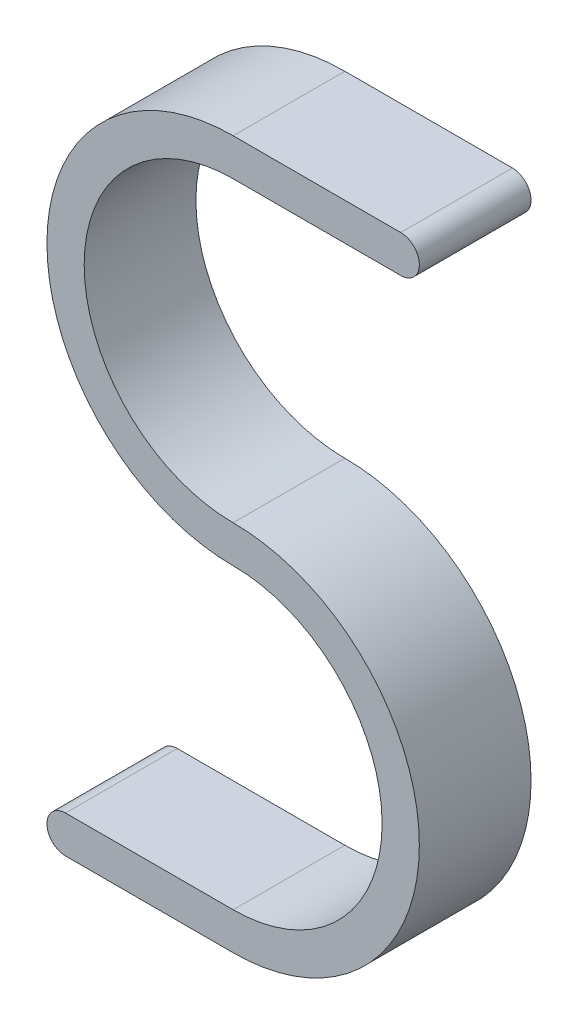
ISO-10303-21;
HEADER;
FILE_DESCRIPTION(('STEP AP214'),'2;1');
FILE_NAME('part.step','',(''),(''),'','','');
FILE_SCHEMA(('AUTOMOTIVE_DESIGN { 1 0 10303 214 1 1 1 1 }'));
ENDSEC;
DATA;
#1=APPLICATION_CONTEXT('core data for automotive mechanical design processes');
#2=APPLICATION_PROTOCOL_DEFINITION('international standard','automotive_design',2000,#1);
#3=PRODUCT_CONTEXT('',#1,'mechanical');
#4=PRODUCT('Part','Part','',(#3));
#5=PRODUCT_RELATED_PRODUCT_CATEGORY('part','',(#4));
#6=PRODUCT_DEFINITION_FORMATION('','',#4);
#7=PRODUCT_DEFINITION_CONTEXT('part definition',#1,'design');
#8=PRODUCT_DEFINITION('design','',#6,#7);
#9=PRODUCT_DEFINITION_SHAPE('','',#8);
#10=(LENGTH_UNIT() NAMED_UNIT(*) SI_UNIT(.MILLI.,.METRE.));
#11=(NAMED_UNIT(*) PLANE_ANGLE_UNIT() SI_UNIT($,.RADIAN.));
#12=(NAMED_UNIT(*) SI_UNIT($,.STERADIAN.) SOLID_ANGLE_UNIT());
#13=UNCERTAINTY_MEASURE_WITH_UNIT(LENGTH_MEASURE(1.E-05),#10,'distance_accuracy_value','');
#14=(GEOMETRIC_REPRESENTATION_CONTEXT(3) GLOBAL_UNCERTAINTY_ASSIGNED_CONTEXT((#13)) GLOBAL_UNIT_ASSIGNED_CONTEXT((#10,
#11,#12)) REPRESENTATION_CONTEXT('',''));
#15=CARTESIAN_POINT('',(0.,0.,0.));
#16=DIRECTION('',(0.,0.,1.));
#17=DIRECTION('',(1.,0.,0.));
#18=AXIS2_PLACEMENT_3D('',#15,#16,#17);
#19=CARTESIAN_POINT('',(0.,0.,15.));
#20=DIRECTION('',(0.,0.,-1.));
#21=DIRECTION('',(-1.,0.,0.));
#22=AXIS2_PLACEMENT_3D('',#19,#20,#21);
#23=CYLINDRICAL_SURFACE('',#22,2.5);
#24=CARTESIAN_POINT('',(0.,0.,0.));
#25=DIRECTION('',(0.,0.,1.));
#26=DIRECTION('',(1.,0.,0.));
#27=AXIS2_PLACEMENT_3D('',#24,#25,#26);
#28=CIRCLE('',#27,2.5);
#29=CARTESIAN_POINT('',(0.,-2.5,0.));
#30=VERTEX_POINT('',#29);
#31=CARTESIAN_POINT('',(0.,2.5,0.));
#32=VERTEX_POINT('',#31);
#33=EDGE_CURVE('E145',#30,#32,#28,.T.);
#34=ORIENTED_EDGE('',*,*,#33,.T.);
#35=DIRECTION('',(0.,0.,-1.));
#36=VECTOR('',#35,1.);
#37=CARTESIAN_POINT('',(0.,2.5,15.));
#38=LINE('',#37,#36);
#39=CARTESIAN_POINT('',(0.,2.5,15.));
#40=VERTEX_POINT('',#39);
#41=EDGE_CURVE('E11',#40,#32,#38,.T.);
#42=ORIENTED_EDGE('',*,*,#41,.F.);
#43=CARTESIAN_POINT('',(0.,0.,15.));
#44=DIRECTION('',(0.,0.,1.));
#45=DIRECTION('',(1.,0.,0.));
#46=AXIS2_PLACEMENT_3D('',#43,#44,#45);
#47=CIRCLE('',#46,2.5);
#48=CARTESIAN_POINT('',(0.,-2.5,15.));
#49=VERTEX_POINT('',#48);
#50=EDGE_CURVE('E163',#49,#40,#47,.T.);
#51=ORIENTED_EDGE('',*,*,#50,.F.);
#52=DIRECTION('',(0.,0.,-1.));
#53=VECTOR('',#52,1.);
#54=CARTESIAN_POINT('',(0.,-2.5,15.));
#55=LINE('',#54,#53);
#56=EDGE_CURVE('E141',#49,#30,#55,.T.);
#57=ORIENTED_EDGE('',*,*,#56,.T.);
#58=EDGE_LOOP('',(#34,#42,#51,#57));
#59=FACE_BOUND('',#58,.T.);
#60=ADVANCED_FACE('F37',(#59),#23,.T.);
#61=CARTESIAN_POINT('',(0.,2.5,15.));
#62=DIRECTION('',(0.,-1.,0.));
#63=DIRECTION('',(1.,0.,0.));
#64=AXIS2_PLACEMENT_3D('',#61,#62,#63);
#65=PLANE('',#64);
#66=DIRECTION('',(-1.,0.,0.));
#67=VECTOR('',#66,1.);
#68=CARTESIAN_POINT('',(0.,2.5,0.));
#69=LINE('',#68,#67);
#70=CARTESIAN_POINT('',(-22.5,2.5,0.));
#71=VERTEX_POINT('',#70);
#72=EDGE_CURVE('E148',#32,#71,#69,.T.);
#73=ORIENTED_EDGE('',*,*,#72,.T.);
#74=DIRECTION('',(0.,0.,-1.));
#75=VECTOR('',#74,1.);
#76=CARTESIAN_POINT('',(-22.5,2.5,15.));
#77=LINE('',#76,#75);
#78=CARTESIAN_POINT('',(-22.5,2.5,15.));
#79=VERTEX_POINT('',#78);
#80=EDGE_CURVE('E45',#79,#71,#77,.T.);
#81=ORIENTED_EDGE('',*,*,#80,.F.);
#82=DIRECTION('',(-1.,0.,0.));
#83=VECTOR('',#82,1.);
#84=CARTESIAN_POINT('',(0.,2.5,15.));
#85=LINE('',#84,#83);
#86=EDGE_CURVE('E102',#40,#79,#85,.T.);
#87=ORIENTED_EDGE('',*,*,#86,.F.);
#88=ORIENTED_EDGE('',*,*,#41,.T.);
#89=EDGE_LOOP('',(#73,#81,#87,#88));
#90=FACE_BOUND('',#89,.T.);
#91=ADVANCED_FACE('F212',(#90),#65,.F.);
#92=CARTESIAN_POINT('',(-22.5,-22.5,15.));
#93=DIRECTION('',(0.,0.,-1.));
#94=DIRECTION('',(-1.,0.,0.));
#95=AXIS2_PLACEMENT_3D('',#92,#93,#94);
#96=CYLINDRICAL_SURFACE('',#95,25.);
#97=CARTESIAN_POINT('',(-22.5,-22.5,0.));
#98=DIRECTION('',(0.,0.,1.));
#99=DIRECTION('',(1.,0.,0.));
#100=AXIS2_PLACEMENT_3D('',#97,#98,#99);
#101=CIRCLE('',#100,25.);
#102=CARTESIAN_POINT('',(-22.5,-47.5,0.));
#103=VERTEX_POINT('',#102);
#104=EDGE_CURVE('E150',#71,#103,#101,.T.);
#105=ORIENTED_EDGE('',*,*,#104,.T.);
#106=DIRECTION('',(0.,0.,-1.));
#107=VECTOR('',#106,1.);
#108=CARTESIAN_POINT('',(-22.5,-47.5,15.));
#109=LINE('',#108,#107);
#110=CARTESIAN_POINT('',(-22.5,-47.5,15.));
#111=VERTEX_POINT('',#110);
#112=EDGE_CURVE('E176',#111,#103,#109,.T.);
#113=ORIENTED_EDGE('',*,*,#112,.F.);
#114=CARTESIAN_POINT('',(-22.5,-22.5,15.));
#115=DIRECTION('',(0.,0.,1.));
#116=DIRECTION('',(1.,0.,0.));
#117=AXIS2_PLACEMENT_3D('',#114,#115,#116);
#118=CIRCLE('',#117,25.);
#119=EDGE_CURVE('E184',#79,#111,#118,.T.);
#120=ORIENTED_EDGE('',*,*,#119,.F.);
#121=ORIENTED_EDGE('',*,*,#80,.T.);
#122=EDGE_LOOP('',(#105,#113,#120,#121));
#123=FACE_BOUND('',#122,.T.);
#124=ADVANCED_FACE('F182',(#123),#96,.T.);
#125=CARTESIAN_POINT('',(-22.5,-67.5,15.));
#126=DIRECTION('',(0.,0.,-1.));
#127=DIRECTION('',(-1.,0.,0.));
#128=AXIS2_PLACEMENT_3D('',#125,#126,#127);
#129=CYLINDRICAL_SURFACE('',#128,20.);
#130=CARTESIAN_POINT('',(-22.5,-67.5,0.));
#131=DIRECTION('',(0.,0.,-1.));
#132=DIRECTION('',(-1.,0.,0.));
#133=AXIS2_PLACEMENT_3D('',#130,#131,#132);
#134=CIRCLE('',#133,20.);
#135=CARTESIAN_POINT('',(-22.5,-87.5,0.));
#136=VERTEX_POINT('',#135);
#137=EDGE_CURVE('E152',#103,#136,#134,.T.);
#138=ORIENTED_EDGE('',*,*,#137,.T.);
#139=DIRECTION('',(0.,0.,-1.));
#140=VECTOR('',#139,1.);
#141=CARTESIAN_POINT('',(-22.5,-87.5,15.));
#142=LINE('',#141,#140);
#143=CARTESIAN_POINT('',(-22.5,-87.5,15.));
#144=VERTEX_POINT('',#143);
#145=EDGE_CURVE('E173',#144,#136,#142,.T.);
#146=ORIENTED_EDGE('',*,*,#145,.F.);
#147=CARTESIAN_POINT('',(-22.5,-67.5,15.));
#148=DIRECTION('',(0.,0.,-1.));
#149=DIRECTION('',(-1.,0.,0.));
#150=AXIS2_PLACEMENT_3D('',#147,#148,#149);
#151=CIRCLE('',#150,20.);
#152=EDGE_CURVE('E202',#111,#144,#151,.T.);
#153=ORIENTED_EDGE('',*,*,#152,.F.);
#154=ORIENTED_EDGE('',*,*,#112,.T.);
#155=EDGE_LOOP('',(#138,#146,#153,#154));
#156=FACE_BOUND('',#155,.T.);
#157=ADVANCED_FACE('F193',(#156),#129,.F.);
#158=CARTESIAN_POINT('',(-22.5,-87.5,15.));
#159=DIRECTION('',(0.,-1.,0.));
#160=DIRECTION('',(1.,0.,0.));
#161=AXIS2_PLACEMENT_3D('',#158,#159,#160);
#162=PLANE('',#161);
#163=DIRECTION('',(-1.,0.,0.));
#164=VECTOR('',#163,1.);
#165=CARTESIAN_POINT('',(-22.5,-87.5,0.));
#166=LINE('',#165,#164);
#167=CARTESIAN_POINT('',(-45.,-87.5,0.));
#168=VERTEX_POINT('',#167);
#169=EDGE_CURVE('E154',#136,#168,#166,.T.);
#170=ORIENTED_EDGE('',*,*,#169,.T.);
#171=DIRECTION('',(0.,0.,-1.));
#172=VECTOR('',#171,1.);
#173=CARTESIAN_POINT('',(-45.,-87.5,15.));
#174=LINE('',#173,#172);
#175=CARTESIAN_POINT('',(-45.,-87.5,15.));
#176=VERTEX_POINT('',#175);
#177=EDGE_CURVE('E170',#176,#168,#174,.T.);
#178=ORIENTED_EDGE('',*,*,#177,.F.);
#179=DIRECTION('',(-1.,0.,0.));
#180=VECTOR('',#179,1.);
#181=CARTESIAN_POINT('',(-22.5,-87.5,15.));
#182=LINE('',#181,#180);
#183=EDGE_CURVE('E199',#144,#176,#182,.T.);
#184=ORIENTED_EDGE('',*,*,#183,.F.);
#185=ORIENTED_EDGE('',*,*,#145,.T.);
#186=EDGE_LOOP('',(#170,#178,#184,#185));
#187=FACE_BOUND('',#186,.T.);
#188=ADVANCED_FACE('F197',(#187),#162,.F.);
#189=CARTESIAN_POINT('',(-45.,-90.,15.));
#190=DIRECTION('',(0.,0.,-1.));
#191=DIRECTION('',(-1.,0.,0.));
#192=AXIS2_PLACEMENT_3D('',#189,#190,#191);
#193=CYLINDRICAL_SURFACE('',#192,2.50000000000001);
#194=CARTESIAN_POINT('',(-45.,-90.,0.));
#195=DIRECTION('',(0.,0.,1.));
#196=DIRECTION('',(1.,0.,0.));
#197=AXIS2_PLACEMENT_3D('',#194,#195,#196);
#198=CIRCLE('',#197,2.50000000000001);
#199=CARTESIAN_POINT('',(-45.,-92.5,0.));
#200=VERTEX_POINT('',#199);
#201=EDGE_CURVE('E156',#168,#200,#198,.T.);
#202=ORIENTED_EDGE('',*,*,#201,.T.);
#203=DIRECTION('',(0.,0.,-1.));
#204=VECTOR('',#203,1.);
#205=CARTESIAN_POINT('',(-45.,-92.5,15.));
#206=LINE('',#205,#204);
#207=CARTESIAN_POINT('',(-45.,-92.5,15.));
#208=VERTEX_POINT('',#207);
#209=EDGE_CURVE('E167',#208,#200,#206,.T.);
#210=ORIENTED_EDGE('',*,*,#209,.F.);
#211=CARTESIAN_POINT('',(-45.,-90.,15.));
#212=DIRECTION('',(0.,0.,1.));
#213=DIRECTION('',(1.,0.,0.));
#214=AXIS2_PLACEMENT_3D('',#211,#212,#213);
#215=CIRCLE('',#214,2.50000000000001);
#216=EDGE_CURVE('E201',#176,#208,#215,.T.);
#217=ORIENTED_EDGE('',*,*,#216,.F.);
#218=ORIENTED_EDGE('',*,*,#177,.T.);
#219=EDGE_LOOP('',(#202,#210,#217,#218));
#220=FACE_BOUND('',#219,.T.);
#221=ADVANCED_FACE('F224',(#220),#193,.T.);
#222=CARTESIAN_POINT('',(-22.5,-92.5,15.));
#223=DIRECTION('',(0.,1.,0.));
#224=DIRECTION('',(0.,0.,1.));
#225=AXIS2_PLACEMENT_3D('',#222,#223,#224);
#226=PLANE('',#225);
#227=DIRECTION('',(1.,0.,0.));
#228=VECTOR('',#227,1.);
#229=CARTESIAN_POINT('',(-22.5,-92.5,0.));
#230=LINE('',#229,#228);
#231=CARTESIAN_POINT('',(-22.5,-92.5,0.));
#232=VERTEX_POINT('',#231);
#233=EDGE_CURVE('E158',#200,#232,#230,.T.);
#234=ORIENTED_EDGE('',*,*,#233,.T.);
#235=DIRECTION('',(0.,0.,-1.));
#236=VECTOR('',#235,1.);
#237=CARTESIAN_POINT('',(-22.5,-92.5,15.));
#238=LINE('',#237,#236);
#239=CARTESIAN_POINT('',(-22.5,-92.5,15.));
#240=VERTEX_POINT('',#239);
#241=EDGE_CURVE('E136',#240,#232,#238,.T.);
#242=ORIENTED_EDGE('',*,*,#241,.F.);
#243=DIRECTION('',(1.,0.,0.));
#244=VECTOR('',#243,1.);
#245=CARTESIAN_POINT('',(-22.5,-92.5,15.));
#246=LINE('',#245,#244);
#247=EDGE_CURVE('E127',#208,#240,#246,.T.);
#248=ORIENTED_EDGE('',*,*,#247,.F.);
#249=ORIENTED_EDGE('',*,*,#209,.T.);
#250=EDGE_LOOP('',(#234,#242,#248,#249));
#251=FACE_BOUND('',#250,.T.);
#252=ADVANCED_FACE('F227',(#251),#226,.F.);
#253=CARTESIAN_POINT('',(-22.5,-67.5,15.));
#254=DIRECTION('',(0.,0.,-1.));
#255=DIRECTION('',(-1.,0.,0.));
#256=AXIS2_PLACEMENT_3D('',#253,#254,#255);
#257=CYLINDRICAL_SURFACE('',#256,25.);
#258=CARTESIAN_POINT('',(-22.5,-67.5,0.));
#259=DIRECTION('',(0.,0.,1.));
#260=DIRECTION('',(-1.,0.,0.));
#261=AXIS2_PLACEMENT_3D('',#258,#259,#260);
#262=CIRCLE('',#261,25.);
#263=CARTESIAN_POINT('',(-22.5,-42.5,0.));
#264=VERTEX_POINT('',#263);
#265=EDGE_CURVE('E135',#232,#264,#262,.T.);
#266=ORIENTED_EDGE('',*,*,#265,.T.);
#267=DIRECTION('',(0.,0.,-1.));
#268=VECTOR('',#267,1.);
#269=CARTESIAN_POINT('',(-22.5,-42.5,15.));
#270=LINE('',#269,#268);
#271=CARTESIAN_POINT('',(-22.5,-42.5,15.));
#272=VERTEX_POINT('',#271);
#273=EDGE_CURVE('E132',#272,#264,#270,.T.);
#274=ORIENTED_EDGE('',*,*,#273,.F.);
#275=CARTESIAN_POINT('',(-22.5,-67.5,15.));
#276=DIRECTION('',(0.,0.,1.));
#277=DIRECTION('',(-1.,0.,0.));
#278=AXIS2_PLACEMENT_3D('',#275,#276,#277);
#279=CIRCLE('',#278,25.);
#280=EDGE_CURVE('E121',#240,#272,#279,.T.);
#281=ORIENTED_EDGE('',*,*,#280,.F.);
#282=ORIENTED_EDGE('',*,*,#241,.T.);
#283=EDGE_LOOP('',(#266,#274,#281,#282));
#284=FACE_BOUND('',#283,.T.);
#285=ADVANCED_FACE('F133',(#284),#257,.T.);
#286=CARTESIAN_POINT('',(-22.5,-22.5,15.));
#287=DIRECTION('',(0.,0.,-1.));
#288=DIRECTION('',(-1.,0.,0.));
#289=AXIS2_PLACEMENT_3D('',#286,#287,#288);
#290=CYLINDRICAL_SURFACE('',#289,20.);
#291=CARTESIAN_POINT('',(-22.5,-22.5,0.));
#292=DIRECTION('',(0.,0.,-1.));
#293=DIRECTION('',(1.,0.,0.));
#294=AXIS2_PLACEMENT_3D('',#291,#292,#293);
#295=CIRCLE('',#294,20.);
#296=CARTESIAN_POINT('',(-22.5,-2.5,0.));
#297=VERTEX_POINT('',#296);
#298=EDGE_CURVE('E88',#264,#297,#295,.T.);
#299=ORIENTED_EDGE('',*,*,#298,.T.);
#300=DIRECTION('',(0.,0.,-1.));
#301=VECTOR('',#300,1.);
#302=CARTESIAN_POINT('',(-22.5,-2.5,15.));
#303=LINE('',#302,#301);
#304=CARTESIAN_POINT('',(-22.5,-2.5,15.));
#305=VERTEX_POINT('',#304);
#306=EDGE_CURVE('E137',#305,#297,#303,.T.);
#307=ORIENTED_EDGE('',*,*,#306,.F.);
#308=CARTESIAN_POINT('',(-22.5,-22.5,15.));
#309=DIRECTION('',(0.,0.,-1.));
#310=DIRECTION('',(1.,0.,0.));
#311=AXIS2_PLACEMENT_3D('',#308,#309,#310);
#312=CIRCLE('',#311,20.);
#313=EDGE_CURVE('E125',#272,#305,#312,.T.);
#314=ORIENTED_EDGE('',*,*,#313,.F.);
#315=ORIENTED_EDGE('',*,*,#273,.T.);
#316=EDGE_LOOP('',(#299,#307,#314,#315));
#317=FACE_BOUND('',#316,.T.);
#318=ADVANCED_FACE('F139',(#317),#290,.F.);
#319=CARTESIAN_POINT('',(0.,-2.5,15.));
#320=DIRECTION('',(0.,1.,0.));
#321=DIRECTION('',(0.,0.,1.));
#322=AXIS2_PLACEMENT_3D('',#319,#320,#321);
#323=PLANE('',#322);
#324=DIRECTION('',(1.,0.,0.));
#325=VECTOR('',#324,1.);
#326=CARTESIAN_POINT('',(0.,-2.5,0.));
#327=LINE('',#326,#325);
#328=EDGE_CURVE('E94',#297,#30,#327,.T.);
#329=ORIENTED_EDGE('',*,*,#328,.T.);
#330=ORIENTED_EDGE('',*,*,#56,.F.);
#331=DIRECTION('',(1.,0.,0.));
#332=VECTOR('',#331,1.);
#333=CARTESIAN_POINT('',(0.,-2.5,15.));
#334=LINE('',#333,#332);
#335=EDGE_CURVE('E53',#305,#49,#334,.T.);
#336=ORIENTED_EDGE('',*,*,#335,.F.);
#337=ORIENTED_EDGE('',*,*,#306,.T.);
#338=EDGE_LOOP('',(#329,#330,#336,#337));
#339=FACE_BOUND('',#338,.T.);
#340=ADVANCED_FACE('F236',(#339),#323,.F.);
#341=CARTESIAN_POINT('',(0.,0.,15.));
#342=DIRECTION('',(0.,0.,1.));
#343=DIRECTION('',(1.,0.,0.));
#344=AXIS2_PLACEMENT_3D('',#341,#342,#343);
#345=PLANE('',#344);
#346=ORIENTED_EDGE('',*,*,#50,.T.);
#347=ORIENTED_EDGE('',*,*,#86,.T.);
#348=ORIENTED_EDGE('',*,*,#119,.T.);
#349=ORIENTED_EDGE('',*,*,#152,.T.);
#350=ORIENTED_EDGE('',*,*,#183,.T.);
#351=ORIENTED_EDGE('',*,*,#216,.T.);
#352=ORIENTED_EDGE('',*,*,#247,.T.);
#353=ORIENTED_EDGE('',*,*,#280,.T.);
#354=ORIENTED_EDGE('',*,*,#313,.T.);
#355=ORIENTED_EDGE('',*,*,#335,.T.);
#356=EDGE_LOOP('',(#346,#347,#348,#349,#350,#351,#352,#353,#354,#355));
#357=FACE_BOUND('',#356,.T.);
#358=ADVANCED_FACE('F123',(#357),#345,.T.);
#359=CARTESIAN_POINT('',(0.,0.,0.));
#360=DIRECTION('',(0.,0.,1.));
#361=DIRECTION('',(1.,0.,0.));
#362=AXIS2_PLACEMENT_3D('',#359,#360,#361);
#363=PLANE('',#362);
#364=ORIENTED_EDGE('',*,*,#33,.F.);
#365=ORIENTED_EDGE('',*,*,#328,.F.);
#366=ORIENTED_EDGE('',*,*,#298,.F.);
#367=ORIENTED_EDGE('',*,*,#265,.F.);
#368=ORIENTED_EDGE('',*,*,#233,.F.);
#369=ORIENTED_EDGE('',*,*,#201,.F.);
#370=ORIENTED_EDGE('',*,*,#169,.F.);
#371=ORIENTED_EDGE('',*,*,#137,.F.);
#372=ORIENTED_EDGE('',*,*,#104,.F.);
#373=ORIENTED_EDGE('',*,*,#72,.F.);
#374=EDGE_LOOP('',(#364,#365,#366,#367,#368,#369,#370,#371,#372,#373));
#375=FACE_BOUND('',#374,.T.);
#376=ADVANCED_FACE('F188',(#375),#363,.F.);
#377=CLOSED_SHELL('',(#60,#91,#124,#157,#188,#221,#252,#285,#318,#340,#358,#376));
#378=MANIFOLD_SOLID_BREP('B2',#377);
#379=ADVANCED_BREP_SHAPE_REPRESENTATION('',(#18,#378),#14);
#380=SHAPE_DEFINITION_REPRESENTATION(#9,#379);
ENDSEC;
END-ISO-10303-21;
